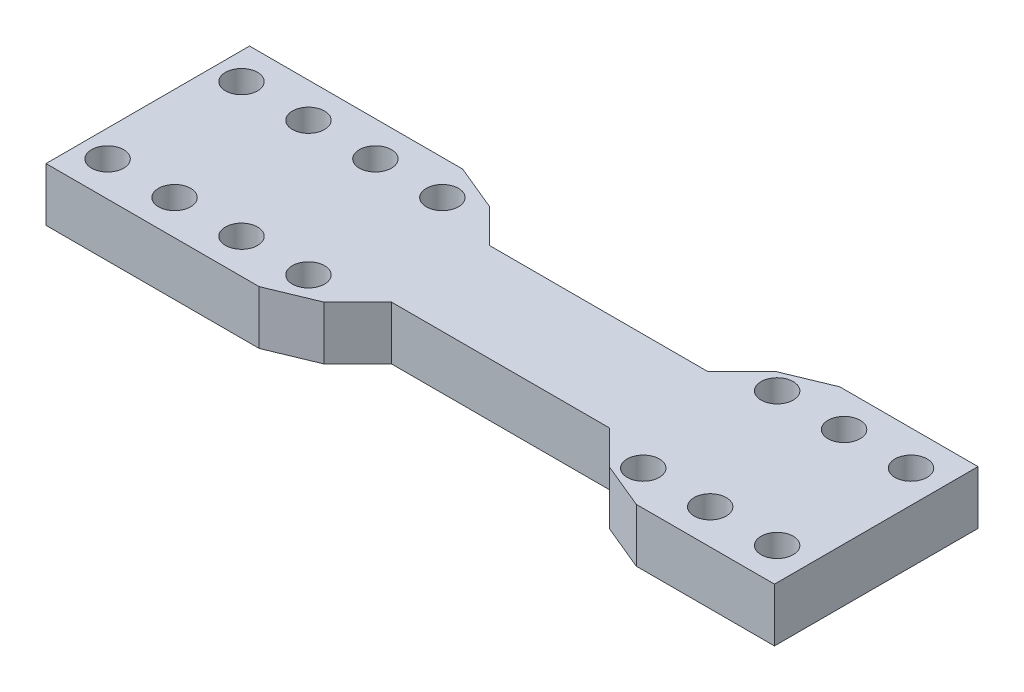
ISO-10303-21;
HEADER;
FILE_DESCRIPTION(('STEP AP214'),'2;1');
FILE_NAME('part.step','',(''),(''),'','','');
FILE_SCHEMA(('AUTOMOTIVE_DESIGN { 1 0 10303 214 1 1 1 1 }'));
ENDSEC;
DATA;
#1=APPLICATION_CONTEXT('core data for automotive mechanical design processes');
#2=APPLICATION_PROTOCOL_DEFINITION('international standard','automotive_design',2000,#1);
#3=PRODUCT_CONTEXT('',#1,'mechanical');
#4=PRODUCT('Part','Part','',(#3));
#5=PRODUCT_RELATED_PRODUCT_CATEGORY('part','',(#4));
#6=PRODUCT_DEFINITION_FORMATION('','',#4);
#7=PRODUCT_DEFINITION_CONTEXT('part definition',#1,'design');
#8=PRODUCT_DEFINITION('design','',#6,#7);
#9=PRODUCT_DEFINITION_SHAPE('','',#8);
#10=(LENGTH_UNIT() NAMED_UNIT(*) SI_UNIT(.MILLI.,.METRE.));
#11=(NAMED_UNIT(*) PLANE_ANGLE_UNIT() SI_UNIT($,.RADIAN.));
#12=(NAMED_UNIT(*) SI_UNIT($,.STERADIAN.) SOLID_ANGLE_UNIT());
#13=UNCERTAINTY_MEASURE_WITH_UNIT(LENGTH_MEASURE(1.E-05),#10,'distance_accuracy_value','');
#14=(GEOMETRIC_REPRESENTATION_CONTEXT(3) GLOBAL_UNCERTAINTY_ASSIGNED_CONTEXT((#13)) GLOBAL_UNIT_ASSIGNED_CONTEXT((#10,
#11,#12)) REPRESENTATION_CONTEXT('',''));
#15=CARTESIAN_POINT('',(0.,0.,0.));
#16=DIRECTION('',(0.,0.,1.));
#17=DIRECTION('',(1.,0.,0.));
#18=AXIS2_PLACEMENT_3D('',#15,#16,#17);
#19=CARTESIAN_POINT('',(0.,10.,0.));
#20=DIRECTION('',(0.,1.,0.));
#21=DIRECTION('',(0.,0.,1.));
#22=AXIS2_PLACEMENT_3D('',#19,#20,#21);
#23=PLANE('',#22);
#24=CARTESIAN_POINT('',(46.5304978161497,10.,3.85946325853004));
#25=DIRECTION('',(0.,1.,0.));
#26=DIRECTION('',(0.,0.,1.));
#27=AXIS2_PLACEMENT_3D('',#24,#25,#26);
#28=CIRCLE('',#27,3.);
#29=CARTESIAN_POINT('',(46.5304978161497,10.,6.85946325853004));
#30=VERTEX_POINT('',#29);
#31=EDGE_CURVE('E361',#30,#30,#28,.T.);
#32=ORIENTED_EDGE('',*,*,#31,.F.);
#33=EDGE_LOOP('',(#32));
#34=FACE_BOUND('',#33,.T.);
#35=CARTESIAN_POINT('',(59.0304978161497,10.,28.85946325853));
#36=DIRECTION('',(0.,1.,0.));
#37=DIRECTION('',(0.,0.,1.));
#38=AXIS2_PLACEMENT_3D('',#35,#36,#37);
#39=CIRCLE('',#38,3.);
#40=CARTESIAN_POINT('',(59.0304978161497,10.,31.85946325853));
#41=VERTEX_POINT('',#40);
#42=EDGE_CURVE('E349',#41,#41,#39,.T.);
#43=ORIENTED_EDGE('',*,*,#42,.F.);
#44=EDGE_LOOP('',(#43));
#45=FACE_BOUND('',#44,.T.);
#46=CARTESIAN_POINT('',(34.0304978161497,10.,3.85946325853004));
#47=DIRECTION('',(0.,1.,0.));
#48=DIRECTION('',(0.,0.,1.));
#49=AXIS2_PLACEMENT_3D('',#46,#47,#48);
#50=CIRCLE('',#49,3.00000000000001);
#51=CARTESIAN_POINT('',(34.0304978161497,10.,6.85946325853005));
#52=VERTEX_POINT('',#51);
#53=EDGE_CURVE('E337',#52,#52,#50,.T.);
#54=ORIENTED_EDGE('',*,*,#53,.F.);
#55=EDGE_LOOP('',(#54));
#56=FACE_BOUND('',#55,.T.);
#57=CARTESIAN_POINT('',(-28.4695021838503,10.,28.85946325853));
#58=DIRECTION('',(0.,1.,0.));
#59=DIRECTION('',(0.,0.,1.));
#60=AXIS2_PLACEMENT_3D('',#57,#58,#59);
#61=CIRCLE('',#60,3.);
#62=CARTESIAN_POINT('',(-28.4695021838503,10.,31.85946325853));
#63=VERTEX_POINT('',#62);
#64=EDGE_CURVE('E325',#63,#63,#61,.T.);
#65=ORIENTED_EDGE('',*,*,#64,.F.);
#66=EDGE_LOOP('',(#65));
#67=FACE_BOUND('',#66,.T.);
#68=CARTESIAN_POINT('',(-53.4695021838503,10.,3.85946325853004));
#69=DIRECTION('',(0.,1.,0.));
#70=DIRECTION('',(0.,0.,1.));
#71=AXIS2_PLACEMENT_3D('',#68,#69,#70);
#72=CIRCLE('',#71,3.00000000000001);
#73=CARTESIAN_POINT('',(-53.4695021838503,10.,6.85946325853005));
#74=VERTEX_POINT('',#73);
#75=EDGE_CURVE('E313',#74,#74,#72,.T.);
#76=ORIENTED_EDGE('',*,*,#75,.F.);
#77=EDGE_LOOP('',(#76));
#78=FACE_BOUND('',#77,.T.);
#79=CARTESIAN_POINT('',(-40.9695021838503,10.,28.85946325853));
#80=DIRECTION('',(0.,1.,0.));
#81=DIRECTION('',(0.,0.,1.));
#82=AXIS2_PLACEMENT_3D('',#79,#80,#81);
#83=CIRCLE('',#82,3.);
#84=CARTESIAN_POINT('',(-40.9695021838503,10.,31.85946325853));
#85=VERTEX_POINT('',#84);
#86=EDGE_CURVE('E301',#85,#85,#83,.T.);
#87=ORIENTED_EDGE('',*,*,#86,.F.);
#88=EDGE_LOOP('',(#87));
#89=FACE_BOUND('',#88,.T.);
#90=CARTESIAN_POINT('',(-65.9695021838503,10.,3.85946325853004));
#91=DIRECTION('',(0.,1.,0.));
#92=DIRECTION('',(0.,0.,1.));
#93=AXIS2_PLACEMENT_3D('',#90,#91,#92);
#94=CIRCLE('',#93,3.00000000000001);
#95=CARTESIAN_POINT('',(-65.9695021838503,10.,6.85946325853005));
#96=VERTEX_POINT('',#95);
#97=EDGE_CURVE('E201',#96,#96,#94,.T.);
#98=ORIENTED_EDGE('',*,*,#97,.F.);
#99=EDGE_LOOP('',(#98));
#100=FACE_BOUND('',#99,.T.);
#101=DIRECTION('',(0.707106781186522,0.,0.707106781186574));
#102=VECTOR('',#101,1.);
#103=CARTESIAN_POINT('',(24.3812054782563,10.,25.5081234563012));
#104=LINE('',#103,#102);
#105=CARTESIAN_POINT('',(24.3812054782563,10.,25.5081234563012));
#106=VERTEX_POINT('',#105);
#107=CARTESIAN_POINT('',(30.6970113745519,10.,31.8239293525971));
#108=VERTEX_POINT('',#107);
#109=EDGE_CURVE('E175',#106,#108,#104,.T.);
#110=ORIENTED_EDGE('',*,*,#109,.T.);
#111=DIRECTION('',(-0.92387953251128,0.,-0.382683432365105));
#112=VECTOR('',#111,1.);
#113=CARTESIAN_POINT('',(-6.75598488988871,10.,16.3103903483563));
#114=LINE('',#113,#112);
#115=CARTESIAN_POINT('',(39.2325452804846,10.,35.35946325853));
#116=VERTEX_POINT('',#115);
#117=EDGE_CURVE('E259',#108,#116,#114,.F.);
#118=ORIENTED_EDGE('',*,*,#117,.T.);
#119=DIRECTION('',(1.,0.,0.));
#120=VECTOR('',#119,1.);
#121=CARTESIAN_POINT('',(34.2325452804845,10.,35.35946325853));
#122=LINE('',#121,#120);
#123=CARTESIAN_POINT('',(65.0304978161497,10.,35.35946325853));
#124=VERTEX_POINT('',#123);
#125=EDGE_CURVE('E177',#116,#124,#122,.T.);
#126=ORIENTED_EDGE('',*,*,#125,.T.);
#127=DIRECTION('',(0.,0.,-1.));
#128=VECTOR('',#127,1.);
#129=CARTESIAN_POINT('',(65.0304978161497,10.,35.35946325853));
#130=LINE('',#129,#128);
#131=CARTESIAN_POINT('',(65.0304978161497,10.,-2.64053674146996));
#132=VERTEX_POINT('',#131);
#133=EDGE_CURVE('E182',#124,#132,#130,.T.);
#134=ORIENTED_EDGE('',*,*,#133,.T.);
#135=DIRECTION('',(-1.,0.,0.));
#136=VECTOR('',#135,1.);
#137=CARTESIAN_POINT('',(34.2325452804845,10.,-2.64053674146996));
#138=LINE('',#137,#136);
#139=CARTESIAN_POINT('',(39.2325452804845,10.,-2.64053674146996));
#140=VERTEX_POINT('',#139);
#141=EDGE_CURVE('E184',#132,#140,#138,.T.);
#142=ORIENTED_EDGE('',*,*,#141,.T.);
#143=DIRECTION('',(0.923879532511284,0.,-0.382683432365096));
#144=VECTOR('',#143,1.);
#145=CARTESIAN_POINT('',(4.81190251679016,10.,11.6169603168518));
#146=LINE('',#145,#144);
#147=CARTESIAN_POINT('',(30.6970113745518,10.,0.894997164462842));
#148=VERTEX_POINT('',#147);
#149=EDGE_CURVE('E256',#140,#148,#146,.F.);
#150=ORIENTED_EDGE('',*,*,#149,.T.);
#151=DIRECTION('',(-0.707106781186539,0.,0.707106781186556));
#152=VECTOR('',#151,1.);
#153=CARTESIAN_POINT('',(24.3812054782563,10.,7.21080306075843));
#154=LINE('',#153,#152);
#155=CARTESIAN_POINT('',(24.3812054782563,10.,7.21080306075843));
#156=VERTEX_POINT('',#155);
#157=EDGE_CURVE('E187',#148,#156,#154,.T.);
#158=ORIENTED_EDGE('',*,*,#157,.T.);
#159=DIRECTION('',(-1.,0.,0.));
#160=VECTOR('',#159,1.);
#161=CARTESIAN_POINT('',(-16.3292290877633,10.,7.21080306075843));
#162=LINE('',#161,#160);
#163=CARTESIAN_POINT('',(-16.3292290877633,10.,7.21080306075843));
#164=VERTEX_POINT('',#163);
#165=EDGE_CURVE('E189',#156,#164,#162,.T.);
#166=ORIENTED_EDGE('',*,*,#165,.T.);
#167=DIRECTION('',(-0.707106781186556,0.,-0.707106781186539));
#168=VECTOR('',#167,1.);
#169=CARTESIAN_POINT('',(-26.180568889992,10.,-2.64053674146996));
#170=LINE('',#169,#168);
#171=CARTESIAN_POINT('',(-22.6450349840591,10.,0.894997164462787));
#172=VERTEX_POINT('',#171);
#173=EDGE_CURVE('E191',#164,#172,#170,.T.);
#174=ORIENTED_EDGE('',*,*,#173,.T.);
#175=DIRECTION('',(0.923879532511289,0.,0.382683432365084));
#176=VECTOR('',#175,1.);
#177=CARTESIAN_POINT('',(-3.63271787537924,10.,8.77015676301589));
#178=LINE('',#177,#176);
#179=CARTESIAN_POINT('',(-31.180568889992,10.,-2.64053674146996));
#180=VERTEX_POINT('',#179);
#181=EDGE_CURVE('E51',#172,#180,#178,.F.);
#182=ORIENTED_EDGE('',*,*,#181,.T.);
#183=DIRECTION('',(-1.,0.,0.));
#184=VECTOR('',#183,1.);
#185=CARTESIAN_POINT('',(-70.9695021838503,10.,-2.64053674146996));
#186=LINE('',#185,#184);
#187=CARTESIAN_POINT('',(-70.9695021838503,10.,-2.64053674146996));
#188=VERTEX_POINT('',#187);
#189=EDGE_CURVE('E193',#180,#188,#186,.T.);
#190=ORIENTED_EDGE('',*,*,#189,.T.);
#191=DIRECTION('',(0.,0.,1.));
#192=VECTOR('',#191,1.);
#193=CARTESIAN_POINT('',(-70.9695021838503,10.,35.35946325853));
#194=LINE('',#193,#192);
#195=CARTESIAN_POINT('',(-70.9695021838503,10.,35.35946325853));
#196=VERTEX_POINT('',#195);
#197=EDGE_CURVE('E195',#188,#196,#194,.T.);
#198=ORIENTED_EDGE('',*,*,#197,.T.);
#199=DIRECTION('',(1.,0.,0.));
#200=VECTOR('',#199,1.);
#201=CARTESIAN_POINT('',(-70.9695021838503,10.,35.35946325853));
#202=LINE('',#201,#200);
#203=CARTESIAN_POINT('',(-31.180568889992,10.,35.35946325853));
#204=VERTEX_POINT('',#203);
#205=EDGE_CURVE('E160',#196,#204,#202,.T.);
#206=ORIENTED_EDGE('',*,*,#205,.T.);
#207=DIRECTION('',(-0.923879532511285,0.,0.382683432365095));
#208=VECTOR('',#207,1.);
#209=CARTESIAN_POINT('',(7.93516953129942,10.,19.1571939021925));
#210=LINE('',#209,#208);
#211=CARTESIAN_POINT('',(-22.6450349840592,10.,31.8239293525972));
#212=VERTEX_POINT('',#211);
#213=EDGE_CURVE('E156',#204,#212,#210,.F.);
#214=ORIENTED_EDGE('',*,*,#213,.T.);
#215=DIRECTION('',(0.707106781186539,0.,-0.707106781186556));
#216=VECTOR('',#215,1.);
#217=CARTESIAN_POINT('',(-26.180568889992,10.,35.35946325853));
#218=LINE('',#217,#216);
#219=CARTESIAN_POINT('',(-16.3292290877633,10.,25.5081234563012));
#220=VERTEX_POINT('',#219);
#221=EDGE_CURVE('E147',#212,#220,#218,.T.);
#222=ORIENTED_EDGE('',*,*,#221,.T.);
#223=DIRECTION('',(1.,0.,0.));
#224=VECTOR('',#223,1.);
#225=CARTESIAN_POINT('',(-16.3292290877633,10.,25.5081234563012));
#226=LINE('',#225,#224);
#227=EDGE_CURVE('E152',#220,#106,#226,.T.);
#228=ORIENTED_EDGE('',*,*,#227,.T.);
#229=EDGE_LOOP('',(#110,#118,#126,#134,#142,#150,#158,#166,#174,#182,#190,#198,#206,#214,#222,#228));
#230=FACE_BOUND('',#229,.T.);
#231=CARTESIAN_POINT('',(-40.9695021838503,10.,3.85946325853004));
#232=DIRECTION('',(0.,1.,0.));
#233=DIRECTION('',(0.,0.,1.));
#234=AXIS2_PLACEMENT_3D('',#231,#232,#233);
#235=CIRCLE('',#234,3.);
#236=CARTESIAN_POINT('',(-40.9695021838503,10.,6.85946325853004));
#237=VERTEX_POINT('',#236);
#238=EDGE_CURVE('E295',#237,#237,#235,.T.);
#239=ORIENTED_EDGE('',*,*,#238,.F.);
#240=EDGE_LOOP('',(#239));
#241=FACE_BOUND('',#240,.T.);
#242=CARTESIAN_POINT('',(-65.9695021838503,10.,28.85946325853));
#243=DIRECTION('',(0.,1.,0.));
#244=DIRECTION('',(0.,0.,1.));
#245=AXIS2_PLACEMENT_3D('',#242,#243,#244);
#246=CIRCLE('',#245,3.00000000000001);
#247=CARTESIAN_POINT('',(-65.9695021838503,10.,31.85946325853));
#248=VERTEX_POINT('',#247);
#249=EDGE_CURVE('E307',#248,#248,#246,.T.);
#250=ORIENTED_EDGE('',*,*,#249,.F.);
#251=EDGE_LOOP('',(#250));
#252=FACE_BOUND('',#251,.T.);
#253=CARTESIAN_POINT('',(-28.4695021838503,10.,3.85946325853004));
#254=DIRECTION('',(0.,1.,0.));
#255=DIRECTION('',(0.,0.,1.));
#256=AXIS2_PLACEMENT_3D('',#253,#254,#255);
#257=CIRCLE('',#256,3.);
#258=CARTESIAN_POINT('',(-28.4695021838503,10.,6.85946325853004));
#259=VERTEX_POINT('',#258);
#260=EDGE_CURVE('E319',#259,#259,#257,.T.);
#261=ORIENTED_EDGE('',*,*,#260,.F.);
#262=EDGE_LOOP('',(#261));
#263=FACE_BOUND('',#262,.T.);
#264=CARTESIAN_POINT('',(-53.4695021838503,10.,28.85946325853));
#265=DIRECTION('',(0.,1.,0.));
#266=DIRECTION('',(0.,0.,1.));
#267=AXIS2_PLACEMENT_3D('',#264,#265,#266);
#268=CIRCLE('',#267,3.00000000000001);
#269=CARTESIAN_POINT('',(-53.4695021838503,10.,31.85946325853));
#270=VERTEX_POINT('',#269);
#271=EDGE_CURVE('E331',#270,#270,#268,.T.);
#272=ORIENTED_EDGE('',*,*,#271,.F.);
#273=EDGE_LOOP('',(#272));
#274=FACE_BOUND('',#273,.T.);
#275=CARTESIAN_POINT('',(59.0304978161497,10.,3.85946325853004));
#276=DIRECTION('',(0.,1.,0.));
#277=DIRECTION('',(0.,0.,1.));
#278=AXIS2_PLACEMENT_3D('',#275,#276,#277);
#279=CIRCLE('',#278,3.);
#280=CARTESIAN_POINT('',(59.0304978161497,10.,6.85946325853004));
#281=VERTEX_POINT('',#280);
#282=EDGE_CURVE('E343',#281,#281,#279,.T.);
#283=ORIENTED_EDGE('',*,*,#282,.F.);
#284=EDGE_LOOP('',(#283));
#285=FACE_BOUND('',#284,.T.);
#286=CARTESIAN_POINT('',(34.0304978161497,10.,28.85946325853));
#287=DIRECTION('',(0.,1.,0.));
#288=DIRECTION('',(0.,0.,1.));
#289=AXIS2_PLACEMENT_3D('',#286,#287,#288);
#290=CIRCLE('',#289,3.00000000000001);
#291=CARTESIAN_POINT('',(34.0304978161497,10.,31.85946325853));
#292=VERTEX_POINT('',#291);
#293=EDGE_CURVE('E355',#292,#292,#290,.T.);
#294=ORIENTED_EDGE('',*,*,#293,.F.);
#295=EDGE_LOOP('',(#294));
#296=FACE_BOUND('',#295,.T.);
#297=CARTESIAN_POINT('',(46.5304978161497,10.,28.85946325853));
#298=DIRECTION('',(0.,1.,0.));
#299=DIRECTION('',(0.,0.,1.));
#300=AXIS2_PLACEMENT_3D('',#297,#298,#299);
#301=CIRCLE('',#300,3.);
#302=CARTESIAN_POINT('',(46.5304978161497,10.,31.85946325853));
#303=VERTEX_POINT('',#302);
#304=EDGE_CURVE('E367',#303,#303,#301,.T.);
#305=ORIENTED_EDGE('',*,*,#304,.F.);
#306=EDGE_LOOP('',(#305));
#307=FACE_BOUND('',#306,.T.);
#308=ADVANCED_FACE('F35',(#34,#45,#56,#67,#78,#89,#100,#230,#241,#252,#263,#274,#285,#296,#307),
#23,.T.);
#309=CARTESIAN_POINT('',(0.,0.,0.));
#310=DIRECTION('',(0.,1.,0.));
#311=DIRECTION('',(0.,0.,1.));
#312=AXIS2_PLACEMENT_3D('',#309,#310,#311);
#313=PLANE('',#312);
#314=DIRECTION('',(1.,0.,0.));
#315=VECTOR('',#314,1.);
#316=CARTESIAN_POINT('',(34.2325452804845,0.,35.35946325853));
#317=LINE('',#316,#315);
#318=CARTESIAN_POINT('',(39.2325452804846,0.,35.35946325853));
#319=VERTEX_POINT('',#318);
#320=CARTESIAN_POINT('',(65.0304978161497,0.,35.35946325853));
#321=VERTEX_POINT('',#320);
#322=EDGE_CURVE('E208',#319,#321,#317,.T.);
#323=ORIENTED_EDGE('',*,*,#322,.F.);
#324=DIRECTION('',(0.92387953251128,0.,0.382683432365105));
#325=VECTOR('',#324,1.);
#326=CARTESIAN_POINT('',(39.2325452804846,0.,35.35946325853));
#327=LINE('',#326,#325);
#328=CARTESIAN_POINT('',(30.6970113745519,0.,31.8239293525971));
#329=VERTEX_POINT('',#328);
#330=EDGE_CURVE('E251',#319,#329,#327,.F.);
#331=ORIENTED_EDGE('',*,*,#330,.T.);
#332=DIRECTION('',(0.707106781186522,0.,0.707106781186574));
#333=VECTOR('',#332,1.);
#334=CARTESIAN_POINT('',(24.3812054782563,0.,25.5081234563012));
#335=LINE('',#334,#333);
#336=CARTESIAN_POINT('',(24.3812054782563,0.,25.5081234563012));
#337=VERTEX_POINT('',#336);
#338=EDGE_CURVE('E205',#337,#329,#335,.T.);
#339=ORIENTED_EDGE('',*,*,#338,.F.);
#340=DIRECTION('',(1.,0.,0.));
#341=VECTOR('',#340,1.);
#342=CARTESIAN_POINT('',(-16.3292290877633,0.,25.5081234563012));
#343=LINE('',#342,#341);
#344=CARTESIAN_POINT('',(-16.3292290877633,0.,25.5081234563012));
#345=VERTEX_POINT('',#344);
#346=EDGE_CURVE('E203',#345,#337,#343,.T.);
#347=ORIENTED_EDGE('',*,*,#346,.F.);
#348=DIRECTION('',(0.707106781186539,0.,-0.707106781186556));
#349=VECTOR('',#348,1.);
#350=CARTESIAN_POINT('',(-26.180568889992,0.,35.35946325853));
#351=LINE('',#350,#349);
#352=CARTESIAN_POINT('',(-22.6450349840592,0.,31.8239293525972));
#353=VERTEX_POINT('',#352);
#354=EDGE_CURVE('E166',#353,#345,#351,.T.);
#355=ORIENTED_EDGE('',*,*,#354,.F.);
#356=DIRECTION('',(0.923879532511285,0.,-0.382683432365095));
#357=VECTOR('',#356,1.);
#358=CARTESIAN_POINT('',(-22.6450349840592,0.,31.8239293525972));
#359=LINE('',#358,#357);
#360=CARTESIAN_POINT('',(-31.180568889992,0.,35.35946325853));
#361=VERTEX_POINT('',#360);
#362=EDGE_CURVE('E249',#353,#361,#359,.F.);
#363=ORIENTED_EDGE('',*,*,#362,.T.);
#364=DIRECTION('',(1.,0.,0.));
#365=VECTOR('',#364,1.);
#366=CARTESIAN_POINT('',(-70.9695021838503,0.,35.35946325853));
#367=LINE('',#366,#365);
#368=CARTESIAN_POINT('',(-70.9695021838503,0.,35.35946325853));
#369=VERTEX_POINT('',#368);
#370=EDGE_CURVE('E198',#369,#361,#367,.T.);
#371=ORIENTED_EDGE('',*,*,#370,.F.);
#372=DIRECTION('',(0.,0.,1.));
#373=VECTOR('',#372,1.);
#374=CARTESIAN_POINT('',(-70.9695021838503,0.,35.35946325853));
#375=LINE('',#374,#373);
#376=CARTESIAN_POINT('',(-70.9695021838503,0.,-2.64053674146996));
#377=VERTEX_POINT('',#376);
#378=EDGE_CURVE('E223',#377,#369,#375,.T.);
#379=ORIENTED_EDGE('',*,*,#378,.F.);
#380=DIRECTION('',(-1.,0.,0.));
#381=VECTOR('',#380,1.);
#382=CARTESIAN_POINT('',(-70.9695021838503,0.,-2.64053674146996));
#383=LINE('',#382,#381);
#384=CARTESIAN_POINT('',(-31.180568889992,0.,-2.64053674146996));
#385=VERTEX_POINT('',#384);
#386=EDGE_CURVE('E221',#385,#377,#383,.T.);
#387=ORIENTED_EDGE('',*,*,#386,.F.);
#388=DIRECTION('',(-0.923879532511289,0.,-0.382683432365084));
#389=VECTOR('',#388,1.);
#390=CARTESIAN_POINT('',(-31.180568889992,0.,-2.64053674146996));
#391=LINE('',#390,#389);
#392=CARTESIAN_POINT('',(-22.6450349840591,0.,0.894997164462787));
#393=VERTEX_POINT('',#392);
#394=EDGE_CURVE('E245',#385,#393,#391,.F.);
#395=ORIENTED_EDGE('',*,*,#394,.T.);
#396=DIRECTION('',(-0.707106781186556,0.,-0.707106781186539));
#397=VECTOR('',#396,1.);
#398=CARTESIAN_POINT('',(-26.180568889992,0.,-2.64053674146996));
#399=LINE('',#398,#397);
#400=CARTESIAN_POINT('',(-16.3292290877633,0.,7.21080306075843));
#401=VERTEX_POINT('',#400);
#402=EDGE_CURVE('E219',#401,#393,#399,.T.);
#403=ORIENTED_EDGE('',*,*,#402,.F.);
#404=DIRECTION('',(-1.,0.,0.));
#405=VECTOR('',#404,1.);
#406=CARTESIAN_POINT('',(-16.3292290877633,0.,7.21080306075843));
#407=LINE('',#406,#405);
#408=CARTESIAN_POINT('',(24.3812054782563,0.,7.21080306075843));
#409=VERTEX_POINT('',#408);
#410=EDGE_CURVE('E217',#409,#401,#407,.T.);
#411=ORIENTED_EDGE('',*,*,#410,.F.);
#412=DIRECTION('',(-0.707106781186539,0.,0.707106781186556));
#413=VECTOR('',#412,1.);
#414=CARTESIAN_POINT('',(24.3812054782563,0.,7.21080306075843));
#415=LINE('',#414,#413);
#416=CARTESIAN_POINT('',(30.6970113745518,0.,0.894997164462842));
#417=VERTEX_POINT('',#416);
#418=EDGE_CURVE('E215',#417,#409,#415,.T.);
#419=ORIENTED_EDGE('',*,*,#418,.F.);
#420=DIRECTION('',(-0.923879532511284,0.,0.382683432365096));
#421=VECTOR('',#420,1.);
#422=CARTESIAN_POINT('',(30.6970113745518,0.,0.894997164462841));
#423=LINE('',#422,#421);
#424=CARTESIAN_POINT('',(39.2325452804845,0.,-2.64053674146996));
#425=VERTEX_POINT('',#424);
#426=EDGE_CURVE('E247',#417,#425,#423,.F.);
#427=ORIENTED_EDGE('',*,*,#426,.T.);
#428=DIRECTION('',(-1.,0.,0.));
#429=VECTOR('',#428,1.);
#430=CARTESIAN_POINT('',(34.2325452804845,0.,-2.64053674146996));
#431=LINE('',#430,#429);
#432=CARTESIAN_POINT('',(65.0304978161497,0.,-2.64053674146996));
#433=VERTEX_POINT('',#432);
#434=EDGE_CURVE('E212',#433,#425,#431,.T.);
#435=ORIENTED_EDGE('',*,*,#434,.F.);
#436=DIRECTION('',(0.,0.,-1.));
#437=VECTOR('',#436,1.);
#438=CARTESIAN_POINT('',(65.0304978161497,0.,35.35946325853));
#439=LINE('',#438,#437);
#440=EDGE_CURVE('E210',#321,#433,#439,.T.);
#441=ORIENTED_EDGE('',*,*,#440,.F.);
#442=EDGE_LOOP('',(#323,#331,#339,#347,#355,#363,#371,#379,#387,#395,#403,#411,#419,#427,#435,#441));
#443=FACE_BOUND('',#442,.T.);
#444=CARTESIAN_POINT('',(-65.9695021838503,0.,3.85946325853004));
#445=DIRECTION('',(0.,1.,0.));
#446=DIRECTION('',(0.,0.,1.));
#447=AXIS2_PLACEMENT_3D('',#444,#445,#446);
#448=CIRCLE('',#447,3.00000000000001);
#449=CARTESIAN_POINT('',(-65.9695021838503,0.,6.85946325853005));
#450=VERTEX_POINT('',#449);
#451=EDGE_CURVE('E292',#450,#450,#448,.T.);
#452=ORIENTED_EDGE('',*,*,#451,.T.);
#453=EDGE_LOOP('',(#452));
#454=FACE_BOUND('',#453,.T.);
#455=CARTESIAN_POINT('',(-40.9695021838503,0.,3.85946325853004));
#456=DIRECTION('',(0.,1.,0.));
#457=DIRECTION('',(0.,0.,1.));
#458=AXIS2_PLACEMENT_3D('',#455,#456,#457);
#459=CIRCLE('',#458,3.);
#460=CARTESIAN_POINT('',(-40.9695021838503,0.,6.85946325853004));
#461=VERTEX_POINT('',#460);
#462=EDGE_CURVE('E298',#461,#461,#459,.T.);
#463=ORIENTED_EDGE('',*,*,#462,.T.);
#464=EDGE_LOOP('',(#463));
#465=FACE_BOUND('',#464,.T.);
#466=CARTESIAN_POINT('',(-40.9695021838503,0.,28.85946325853));
#467=DIRECTION('',(0.,1.,0.));
#468=DIRECTION('',(0.,0.,1.));
#469=AXIS2_PLACEMENT_3D('',#466,#467,#468);
#470=CIRCLE('',#469,3.);
#471=CARTESIAN_POINT('',(-40.9695021838503,0.,31.85946325853));
#472=VERTEX_POINT('',#471);
#473=EDGE_CURVE('E304',#472,#472,#470,.T.);
#474=ORIENTED_EDGE('',*,*,#473,.T.);
#475=EDGE_LOOP('',(#474));
#476=FACE_BOUND('',#475,.T.);
#477=CARTESIAN_POINT('',(-65.9695021838503,0.,28.85946325853));
#478=DIRECTION('',(0.,1.,0.));
#479=DIRECTION('',(0.,0.,1.));
#480=AXIS2_PLACEMENT_3D('',#477,#478,#479);
#481=CIRCLE('',#480,3.00000000000001);
#482=CARTESIAN_POINT('',(-65.9695021838503,0.,31.85946325853));
#483=VERTEX_POINT('',#482);
#484=EDGE_CURVE('E310',#483,#483,#481,.T.);
#485=ORIENTED_EDGE('',*,*,#484,.T.);
#486=EDGE_LOOP('',(#485));
#487=FACE_BOUND('',#486,.T.);
#488=CARTESIAN_POINT('',(-53.4695021838503,0.,3.85946325853004));
#489=DIRECTION('',(0.,1.,0.));
#490=DIRECTION('',(0.,0.,1.));
#491=AXIS2_PLACEMENT_3D('',#488,#489,#490);
#492=CIRCLE('',#491,3.00000000000001);
#493=CARTESIAN_POINT('',(-53.4695021838503,0.,6.85946325853005));
#494=VERTEX_POINT('',#493);
#495=EDGE_CURVE('E316',#494,#494,#492,.T.);
#496=ORIENTED_EDGE('',*,*,#495,.T.);
#497=EDGE_LOOP('',(#496));
#498=FACE_BOUND('',#497,.T.);
#499=CARTESIAN_POINT('',(-28.4695021838503,0.,3.85946325853004));
#500=DIRECTION('',(0.,1.,0.));
#501=DIRECTION('',(0.,0.,1.));
#502=AXIS2_PLACEMENT_3D('',#499,#500,#501);
#503=CIRCLE('',#502,3.);
#504=CARTESIAN_POINT('',(-28.4695021838503,0.,6.85946325853004));
#505=VERTEX_POINT('',#504);
#506=EDGE_CURVE('E322',#505,#505,#503,.T.);
#507=ORIENTED_EDGE('',*,*,#506,.T.);
#508=EDGE_LOOP('',(#507));
#509=FACE_BOUND('',#508,.T.);
#510=CARTESIAN_POINT('',(-28.4695021838503,0.,28.85946325853));
#511=DIRECTION('',(0.,1.,0.));
#512=DIRECTION('',(0.,0.,1.));
#513=AXIS2_PLACEMENT_3D('',#510,#511,#512);
#514=CIRCLE('',#513,3.);
#515=CARTESIAN_POINT('',(-28.4695021838503,0.,31.85946325853));
#516=VERTEX_POINT('',#515);
#517=EDGE_CURVE('E328',#516,#516,#514,.T.);
#518=ORIENTED_EDGE('',*,*,#517,.T.);
#519=EDGE_LOOP('',(#518));
#520=FACE_BOUND('',#519,.T.);
#521=CARTESIAN_POINT('',(-53.4695021838503,0.,28.85946325853));
#522=DIRECTION('',(0.,1.,0.));
#523=DIRECTION('',(0.,0.,1.));
#524=AXIS2_PLACEMENT_3D('',#521,#522,#523);
#525=CIRCLE('',#524,3.00000000000001);
#526=CARTESIAN_POINT('',(-53.4695021838503,0.,31.85946325853));
#527=VERTEX_POINT('',#526);
#528=EDGE_CURVE('E334',#527,#527,#525,.T.);
#529=ORIENTED_EDGE('',*,*,#528,.T.);
#530=EDGE_LOOP('',(#529));
#531=FACE_BOUND('',#530,.T.);
#532=CARTESIAN_POINT('',(34.0304978161497,0.,3.85946325853004));
#533=DIRECTION('',(0.,1.,0.));
#534=DIRECTION('',(0.,0.,1.));
#535=AXIS2_PLACEMENT_3D('',#532,#533,#534);
#536=CIRCLE('',#535,3.00000000000001);
#537=CARTESIAN_POINT('',(34.0304978161497,0.,6.85946325853005));
#538=VERTEX_POINT('',#537);
#539=EDGE_CURVE('E340',#538,#538,#536,.T.);
#540=ORIENTED_EDGE('',*,*,#539,.T.);
#541=EDGE_LOOP('',(#540));
#542=FACE_BOUND('',#541,.T.);
#543=CARTESIAN_POINT('',(59.0304978161497,0.,3.85946325853004));
#544=DIRECTION('',(0.,1.,0.));
#545=DIRECTION('',(0.,0.,1.));
#546=AXIS2_PLACEMENT_3D('',#543,#544,#545);
#547=CIRCLE('',#546,3.);
#548=CARTESIAN_POINT('',(59.0304978161497,0.,6.85946325853004));
#549=VERTEX_POINT('',#548);
#550=EDGE_CURVE('E346',#549,#549,#547,.T.);
#551=ORIENTED_EDGE('',*,*,#550,.T.);
#552=EDGE_LOOP('',(#551));
#553=FACE_BOUND('',#552,.T.);
#554=CARTESIAN_POINT('',(59.0304978161497,0.,28.85946325853));
#555=DIRECTION('',(0.,1.,0.));
#556=DIRECTION('',(0.,0.,1.));
#557=AXIS2_PLACEMENT_3D('',#554,#555,#556);
#558=CIRCLE('',#557,3.);
#559=CARTESIAN_POINT('',(59.0304978161497,0.,31.85946325853));
#560=VERTEX_POINT('',#559);
#561=EDGE_CURVE('E352',#560,#560,#558,.T.);
#562=ORIENTED_EDGE('',*,*,#561,.T.);
#563=EDGE_LOOP('',(#562));
#564=FACE_BOUND('',#563,.T.);
#565=CARTESIAN_POINT('',(34.0304978161497,0.,28.85946325853));
#566=DIRECTION('',(0.,1.,0.));
#567=DIRECTION('',(0.,0.,1.));
#568=AXIS2_PLACEMENT_3D('',#565,#566,#567);
#569=CIRCLE('',#568,3.00000000000001);
#570=CARTESIAN_POINT('',(34.0304978161497,0.,31.85946325853));
#571=VERTEX_POINT('',#570);
#572=EDGE_CURVE('E358',#571,#571,#569,.T.);
#573=ORIENTED_EDGE('',*,*,#572,.T.);
#574=EDGE_LOOP('',(#573));
#575=FACE_BOUND('',#574,.T.);
#576=CARTESIAN_POINT('',(46.5304978161497,0.,3.85946325853004));
#577=DIRECTION('',(0.,1.,0.));
#578=DIRECTION('',(0.,0.,1.));
#579=AXIS2_PLACEMENT_3D('',#576,#577,#578);
#580=CIRCLE('',#579,3.);
#581=CARTESIAN_POINT('',(46.5304978161497,0.,6.85946325853004));
#582=VERTEX_POINT('',#581);
#583=EDGE_CURVE('E364',#582,#582,#580,.T.);
#584=ORIENTED_EDGE('',*,*,#583,.T.);
#585=EDGE_LOOP('',(#584));
#586=FACE_BOUND('',#585,.T.);
#587=CARTESIAN_POINT('',(46.5304978161497,0.,28.85946325853));
#588=DIRECTION('',(0.,1.,0.));
#589=DIRECTION('',(0.,0.,1.));
#590=AXIS2_PLACEMENT_3D('',#587,#588,#589);
#591=CIRCLE('',#590,3.);
#592=CARTESIAN_POINT('',(46.5304978161497,0.,31.85946325853));
#593=VERTEX_POINT('',#592);
#594=EDGE_CURVE('E370',#593,#593,#591,.T.);
#595=ORIENTED_EDGE('',*,*,#594,.T.);
#596=EDGE_LOOP('',(#595));
#597=FACE_BOUND('',#596,.T.);
#598=ADVANCED_FACE('F279',(#443,#454,#465,#476,#487,#498,#509,#520,#531,#542,#553,#564,#575,
#586,#597),#313,.F.);
#599=CARTESIAN_POINT('',(-70.9695021838503,10.,35.35946325853));
#600=DIRECTION('',(0.,0.,-1.));
#601=DIRECTION('',(-1.,0.,0.));
#602=AXIS2_PLACEMENT_3D('',#599,#600,#601);
#603=PLANE('',#602);
#604=ORIENTED_EDGE('',*,*,#370,.T.);
#605=DIRECTION('',(0.,1.,0.));
#606=VECTOR('',#605,1.);
#607=CARTESIAN_POINT('',(-31.180568889992,10.,35.35946325853));
#608=LINE('',#607,#606);
#609=EDGE_CURVE('E263',#361,#204,#608,.T.);
#610=ORIENTED_EDGE('',*,*,#609,.T.);
#611=ORIENTED_EDGE('',*,*,#205,.F.);
#612=DIRECTION('',(0.,-1.,0.));
#613=VECTOR('',#612,1.);
#614=CARTESIAN_POINT('',(-70.9695021838503,10.,35.35946325853));
#615=LINE('',#614,#613);
#616=EDGE_CURVE('E197',#196,#369,#615,.T.);
#617=ORIENTED_EDGE('',*,*,#616,.T.);
#618=EDGE_LOOP('',(#604,#610,#611,#617));
#619=FACE_BOUND('',#618,.T.);
#620=ADVANCED_FACE('F289',(#619),#603,.F.);
#621=CARTESIAN_POINT('',(-26.180568889992,10.,35.35946325853));
#622=DIRECTION('',(-0.707106781186556,0.,-0.707106781186539));
#623=DIRECTION('',(-0.707106781186539,0.,0.707106781186556));
#624=AXIS2_PLACEMENT_3D('',#621,#622,#623);
#625=PLANE('',#624);
#626=ORIENTED_EDGE('',*,*,#221,.F.);
#627=DIRECTION('',(0.,-1.,0.));
#628=VECTOR('',#627,1.);
#629=CARTESIAN_POINT('',(-22.6450349840592,10.,31.8239293525972));
#630=LINE('',#629,#628);
#631=EDGE_CURVE('E261',#212,#353,#630,.T.);
#632=ORIENTED_EDGE('',*,*,#631,.T.);
#633=ORIENTED_EDGE('',*,*,#354,.T.);
#634=DIRECTION('',(0.,-1.,0.));
#635=VECTOR('',#634,1.);
#636=CARTESIAN_POINT('',(-16.3292290877633,10.,25.5081234563012));
#637=LINE('',#636,#635);
#638=EDGE_CURVE('E163',#220,#345,#637,.T.);
#639=ORIENTED_EDGE('',*,*,#638,.F.);
#640=EDGE_LOOP('',(#626,#632,#633,#639));
#641=FACE_BOUND('',#640,.T.);
#642=ADVANCED_FACE('F164',(#641),#625,.F.);
#643=CARTESIAN_POINT('',(-16.3292290877633,10.,25.5081234563012));
#644=DIRECTION('',(0.,0.,-1.));
#645=DIRECTION('',(-1.,0.,0.));
#646=AXIS2_PLACEMENT_3D('',#643,#644,#645);
#647=PLANE('',#646);
#648=ORIENTED_EDGE('',*,*,#346,.T.);
#649=DIRECTION('',(0.,-1.,0.));
#650=VECTOR('',#649,1.);
#651=CARTESIAN_POINT('',(24.3812054782563,10.,25.5081234563012));
#652=LINE('',#651,#650);
#653=EDGE_CURVE('E170',#106,#337,#652,.T.);
#654=ORIENTED_EDGE('',*,*,#653,.F.);
#655=ORIENTED_EDGE('',*,*,#227,.F.);
#656=ORIENTED_EDGE('',*,*,#638,.T.);
#657=EDGE_LOOP('',(#648,#654,#655,#656));
#658=FACE_BOUND('',#657,.T.);
#659=ADVANCED_FACE('F172',(#658),#647,.F.);
#660=CARTESIAN_POINT('',(24.3812054782563,10.,25.5081234563012));
#661=DIRECTION('',(0.707106781186574,0.,-0.707106781186522));
#662=DIRECTION('',(-0.707106781186522,0.,-0.707106781186574));
#663=AXIS2_PLACEMENT_3D('',#660,#661,#662);
#664=PLANE('',#663);
#665=ORIENTED_EDGE('',*,*,#338,.T.);
#666=DIRECTION('',(0.,1.,0.));
#667=VECTOR('',#666,1.);
#668=CARTESIAN_POINT('',(30.6970113745519,10.,31.8239293525971));
#669=LINE('',#668,#667);
#670=EDGE_CURVE('E253',#329,#108,#669,.T.);
#671=ORIENTED_EDGE('',*,*,#670,.T.);
#672=ORIENTED_EDGE('',*,*,#109,.F.);
#673=ORIENTED_EDGE('',*,*,#653,.T.);
#674=EDGE_LOOP('',(#665,#671,#672,#673));
#675=FACE_BOUND('',#674,.T.);
#676=ADVANCED_FACE('F418',(#675),#664,.F.);
#677=CARTESIAN_POINT('',(34.2325452804845,10.,35.35946325853));
#678=DIRECTION('',(0.,0.,-1.));
#679=DIRECTION('',(-1.,0.,0.));
#680=AXIS2_PLACEMENT_3D('',#677,#678,#679);
#681=PLANE('',#680);
#682=ORIENTED_EDGE('',*,*,#125,.F.);
#683=DIRECTION('',(0.,-1.,0.));
#684=VECTOR('',#683,1.);
#685=CARTESIAN_POINT('',(39.2325452804846,10.,35.35946325853));
#686=LINE('',#685,#684);
#687=EDGE_CURVE('E169',#116,#319,#686,.T.);
#688=ORIENTED_EDGE('',*,*,#687,.T.);
#689=ORIENTED_EDGE('',*,*,#322,.T.);
#690=DIRECTION('',(0.,-1.,0.));
#691=VECTOR('',#690,1.);
#692=CARTESIAN_POINT('',(65.0304978161497,10.,35.35946325853));
#693=LINE('',#692,#691);
#694=EDGE_CURVE('E239',#124,#321,#693,.T.);
#695=ORIENTED_EDGE('',*,*,#694,.F.);
#696=EDGE_LOOP('',(#682,#688,#689,#695));
#697=FACE_BOUND('',#696,.T.);
#698=ADVANCED_FACE('F414',(#697),#681,.F.);
#699=CARTESIAN_POINT('',(65.0304978161497,10.,35.35946325853));
#700=DIRECTION('',(-1.,0.,0.));
#701=DIRECTION('',(0.,0.,1.));
#702=AXIS2_PLACEMENT_3D('',#699,#700,#701);
#703=PLANE('',#702);
#704=ORIENTED_EDGE('',*,*,#440,.T.);
#705=DIRECTION('',(0.,-1.,0.));
#706=VECTOR('',#705,1.);
#707=CARTESIAN_POINT('',(65.0304978161497,10.,-2.64053674146996));
#708=LINE('',#707,#706);
#709=EDGE_CURVE('E236',#132,#433,#708,.T.);
#710=ORIENTED_EDGE('',*,*,#709,.F.);
#711=ORIENTED_EDGE('',*,*,#133,.F.);
#712=ORIENTED_EDGE('',*,*,#694,.T.);
#713=EDGE_LOOP('',(#704,#710,#711,#712));
#714=FACE_BOUND('',#713,.T.);
#715=ADVANCED_FACE('F410',(#714),#703,.F.);
#716=CARTESIAN_POINT('',(34.2325452804845,10.,-2.64053674146996));
#717=DIRECTION('',(0.,0.,1.));
#718=DIRECTION('',(1.,0.,0.));
#719=AXIS2_PLACEMENT_3D('',#716,#717,#718);
#720=PLANE('',#719);
#721=ORIENTED_EDGE('',*,*,#434,.T.);
#722=DIRECTION('',(0.,1.,0.));
#723=VECTOR('',#722,1.);
#724=CARTESIAN_POINT('',(39.2325452804845,10.,-2.64053674146996));
#725=LINE('',#724,#723);
#726=EDGE_CURVE('E268',#425,#140,#725,.T.);
#727=ORIENTED_EDGE('',*,*,#726,.T.);
#728=ORIENTED_EDGE('',*,*,#141,.F.);
#729=ORIENTED_EDGE('',*,*,#709,.T.);
#730=EDGE_LOOP('',(#721,#727,#728,#729));
#731=FACE_BOUND('',#730,.T.);
#732=ADVANCED_FACE('F406',(#731),#720,.F.);
#733=CARTESIAN_POINT('',(24.3812054782563,10.,7.21080306075843));
#734=DIRECTION('',(0.707106781186556,0.,0.707106781186539));
#735=DIRECTION('',(0.707106781186539,0.,-0.707106781186556));
#736=AXIS2_PLACEMENT_3D('',#733,#734,#735);
#737=PLANE('',#736);
#738=ORIENTED_EDGE('',*,*,#157,.F.);
#739=DIRECTION('',(0.,-1.,0.));
#740=VECTOR('',#739,1.);
#741=CARTESIAN_POINT('',(30.6970113745518,10.,0.894997164462842));
#742=LINE('',#741,#740);
#743=EDGE_CURVE('E265',#148,#417,#742,.T.);
#744=ORIENTED_EDGE('',*,*,#743,.T.);
#745=ORIENTED_EDGE('',*,*,#418,.T.);
#746=DIRECTION('',(0.,-1.,0.));
#747=VECTOR('',#746,1.);
#748=CARTESIAN_POINT('',(24.3812054782563,10.,7.21080306075843));
#749=LINE('',#748,#747);
#750=EDGE_CURVE('E233',#156,#409,#749,.T.);
#751=ORIENTED_EDGE('',*,*,#750,.F.);
#752=EDGE_LOOP('',(#738,#744,#745,#751));
#753=FACE_BOUND('',#752,.T.);
#754=ADVANCED_FACE('F402',(#753),#737,.F.);
#755=CARTESIAN_POINT('',(-16.3292290877633,10.,7.21080306075843));
#756=DIRECTION('',(0.,0.,1.));
#757=DIRECTION('',(1.,0.,0.));
#758=AXIS2_PLACEMENT_3D('',#755,#756,#757);
#759=PLANE('',#758);
#760=ORIENTED_EDGE('',*,*,#410,.T.);
#761=DIRECTION('',(0.,-1.,0.));
#762=VECTOR('',#761,1.);
#763=CARTESIAN_POINT('',(-16.3292290877633,10.,7.21080306075843));
#764=LINE('',#763,#762);
#765=EDGE_CURVE('E230',#164,#401,#764,.T.);
#766=ORIENTED_EDGE('',*,*,#765,.F.);
#767=ORIENTED_EDGE('',*,*,#165,.F.);
#768=ORIENTED_EDGE('',*,*,#750,.T.);
#769=EDGE_LOOP('',(#760,#766,#767,#768));
#770=FACE_BOUND('',#769,.T.);
#771=ADVANCED_FACE('F399',(#770),#759,.F.);
#772=CARTESIAN_POINT('',(-26.180568889992,10.,-2.64053674146996));
#773=DIRECTION('',(-0.707106781186539,0.,0.707106781186556));
#774=DIRECTION('',(0.707106781186556,0.,0.707106781186539));
#775=AXIS2_PLACEMENT_3D('',#772,#773,#774);
#776=PLANE('',#775);
#777=ORIENTED_EDGE('',*,*,#402,.T.);
#778=DIRECTION('',(0.,1.,0.));
#779=VECTOR('',#778,1.);
#780=CARTESIAN_POINT('',(-22.6450349840591,10.,0.894997164462787));
#781=LINE('',#780,#779);
#782=EDGE_CURVE('E11',#393,#172,#781,.T.);
#783=ORIENTED_EDGE('',*,*,#782,.T.);
#784=ORIENTED_EDGE('',*,*,#173,.F.);
#785=ORIENTED_EDGE('',*,*,#765,.T.);
#786=EDGE_LOOP('',(#777,#783,#784,#785));
#787=FACE_BOUND('',#786,.T.);
#788=ADVANCED_FACE('F396',(#787),#776,.F.);
#789=CARTESIAN_POINT('',(-70.9695021838503,10.,-2.64053674146996));
#790=DIRECTION('',(0.,0.,1.));
#791=DIRECTION('',(1.,0.,0.));
#792=AXIS2_PLACEMENT_3D('',#789,#790,#791);
#793=PLANE('',#792);
#794=ORIENTED_EDGE('',*,*,#189,.F.);
#795=DIRECTION('',(0.,-1.,0.));
#796=VECTOR('',#795,1.);
#797=CARTESIAN_POINT('',(-31.180568889992,10.,-2.64053674146996));
#798=LINE('',#797,#796);
#799=EDGE_CURVE('E44',#180,#385,#798,.T.);
#800=ORIENTED_EDGE('',*,*,#799,.T.);
#801=ORIENTED_EDGE('',*,*,#386,.T.);
#802=DIRECTION('',(0.,-1.,0.));
#803=VECTOR('',#802,1.);
#804=CARTESIAN_POINT('',(-70.9695021838503,10.,-2.64053674146996));
#805=LINE('',#804,#803);
#806=EDGE_CURVE('E227',#188,#377,#805,.T.);
#807=ORIENTED_EDGE('',*,*,#806,.F.);
#808=EDGE_LOOP('',(#794,#800,#801,#807));
#809=FACE_BOUND('',#808,.T.);
#810=ADVANCED_FACE('F273',(#809),#793,.F.);
#811=CARTESIAN_POINT('',(-70.9695021838503,10.,35.35946325853));
#812=DIRECTION('',(1.,0.,0.));
#813=DIRECTION('',(0.,0.,-1.));
#814=AXIS2_PLACEMENT_3D('',#811,#812,#813);
#815=PLANE('',#814);
#816=ORIENTED_EDGE('',*,*,#378,.T.);
#817=ORIENTED_EDGE('',*,*,#616,.F.);
#818=ORIENTED_EDGE('',*,*,#197,.F.);
#819=ORIENTED_EDGE('',*,*,#806,.T.);
#820=EDGE_LOOP('',(#816,#817,#818,#819));
#821=FACE_BOUND('',#820,.T.);
#822=ADVANCED_FACE('F285',(#821),#815,.F.);
#823=CARTESIAN_POINT('',(-65.9695021838503,10.,3.85946325853004));
#824=DIRECTION('',(0.,-1.,0.));
#825=DIRECTION('',(0.,0.,-1.));
#826=AXIS2_PLACEMENT_3D('',#823,#824,#825);
#827=CYLINDRICAL_SURFACE('',#826,3.00000000000001);
#828=ORIENTED_EDGE('',*,*,#97,.T.);
#829=EDGE_LOOP('',(#828));
#830=FACE_BOUND('',#829,.T.);
#831=ORIENTED_EDGE('',*,*,#451,.F.);
#832=EDGE_LOOP('',(#831));
#833=FACE_BOUND('',#832,.T.);
#834=ADVANCED_FACE('F389',(#830,#833),#827,.F.);
#835=CARTESIAN_POINT('',(-40.9695021838503,10.,3.85946325853004));
#836=DIRECTION('',(0.,-1.,0.));
#837=DIRECTION('',(0.,0.,-1.));
#838=AXIS2_PLACEMENT_3D('',#835,#836,#837);
#839=CYLINDRICAL_SURFACE('',#838,3.);
#840=ORIENTED_EDGE('',*,*,#238,.T.);
#841=EDGE_LOOP('',(#840));
#842=FACE_BOUND('',#841,.T.);
#843=ORIENTED_EDGE('',*,*,#462,.F.);
#844=EDGE_LOOP('',(#843));
#845=FACE_BOUND('',#844,.T.);
#846=ADVANCED_FACE('F669',(#842,#845),#839,.F.);
#847=CARTESIAN_POINT('',(-40.9695021838503,10.,28.85946325853));
#848=DIRECTION('',(0.,-1.,0.));
#849=DIRECTION('',(0.,0.,-1.));
#850=AXIS2_PLACEMENT_3D('',#847,#848,#849);
#851=CYLINDRICAL_SURFACE('',#850,3.);
#852=ORIENTED_EDGE('',*,*,#86,.T.);
#853=EDGE_LOOP('',(#852));
#854=FACE_BOUND('',#853,.T.);
#855=ORIENTED_EDGE('',*,*,#473,.F.);
#856=EDGE_LOOP('',(#855));
#857=FACE_BOUND('',#856,.T.);
#858=ADVANCED_FACE('F659',(#854,#857),#851,.F.);
#859=CARTESIAN_POINT('',(-65.9695021838503,10.,28.85946325853));
#860=DIRECTION('',(0.,-1.,0.));
#861=DIRECTION('',(0.,0.,-1.));
#862=AXIS2_PLACEMENT_3D('',#859,#860,#861);
#863=CYLINDRICAL_SURFACE('',#862,3.00000000000001);
#864=ORIENTED_EDGE('',*,*,#249,.T.);
#865=EDGE_LOOP('',(#864));
#866=FACE_BOUND('',#865,.T.);
#867=ORIENTED_EDGE('',*,*,#484,.F.);
#868=EDGE_LOOP('',(#867));
#869=FACE_BOUND('',#868,.T.);
#870=ADVANCED_FACE('F649',(#866,#869),#863,.F.);
#871=CARTESIAN_POINT('',(-53.4695021838503,10.,3.85946325853004));
#872=DIRECTION('',(0.,-1.,0.));
#873=DIRECTION('',(0.,0.,-1.));
#874=AXIS2_PLACEMENT_3D('',#871,#872,#873);
#875=CYLINDRICAL_SURFACE('',#874,3.00000000000001);
#876=ORIENTED_EDGE('',*,*,#75,.T.);
#877=EDGE_LOOP('',(#876));
#878=FACE_BOUND('',#877,.T.);
#879=ORIENTED_EDGE('',*,*,#495,.F.);
#880=EDGE_LOOP('',(#879));
#881=FACE_BOUND('',#880,.T.);
#882=ADVANCED_FACE('F639',(#878,#881),#875,.F.);
#883=CARTESIAN_POINT('',(-28.4695021838503,10.,3.85946325853004));
#884=DIRECTION('',(0.,-1.,0.));
#885=DIRECTION('',(0.,0.,-1.));
#886=AXIS2_PLACEMENT_3D('',#883,#884,#885);
#887=CYLINDRICAL_SURFACE('',#886,3.);
#888=ORIENTED_EDGE('',*,*,#260,.T.);
#889=EDGE_LOOP('',(#888));
#890=FACE_BOUND('',#889,.T.);
#891=ORIENTED_EDGE('',*,*,#506,.F.);
#892=EDGE_LOOP('',(#891));
#893=FACE_BOUND('',#892,.T.);
#894=ADVANCED_FACE('F629',(#890,#893),#887,.F.);
#895=CARTESIAN_POINT('',(-28.4695021838503,10.,28.85946325853));
#896=DIRECTION('',(0.,-1.,0.));
#897=DIRECTION('',(0.,0.,-1.));
#898=AXIS2_PLACEMENT_3D('',#895,#896,#897);
#899=CYLINDRICAL_SURFACE('',#898,3.);
#900=ORIENTED_EDGE('',*,*,#64,.T.);
#901=EDGE_LOOP('',(#900));
#902=FACE_BOUND('',#901,.T.);
#903=ORIENTED_EDGE('',*,*,#517,.F.);
#904=EDGE_LOOP('',(#903));
#905=FACE_BOUND('',#904,.T.);
#906=ADVANCED_FACE('F619',(#902,#905),#899,.F.);
#907=CARTESIAN_POINT('',(-53.4695021838503,10.,28.85946325853));
#908=DIRECTION('',(0.,-1.,0.));
#909=DIRECTION('',(0.,0.,-1.));
#910=AXIS2_PLACEMENT_3D('',#907,#908,#909);
#911=CYLINDRICAL_SURFACE('',#910,3.00000000000001);
#912=ORIENTED_EDGE('',*,*,#271,.T.);
#913=EDGE_LOOP('',(#912));
#914=FACE_BOUND('',#913,.T.);
#915=ORIENTED_EDGE('',*,*,#528,.F.);
#916=EDGE_LOOP('',(#915));
#917=FACE_BOUND('',#916,.T.);
#918=ADVANCED_FACE('F609',(#914,#917),#911,.F.);
#919=CARTESIAN_POINT('',(34.0304978161497,10.,3.85946325853004));
#920=DIRECTION('',(0.,-1.,0.));
#921=DIRECTION('',(0.,0.,-1.));
#922=AXIS2_PLACEMENT_3D('',#919,#920,#921);
#923=CYLINDRICAL_SURFACE('',#922,3.00000000000001);
#924=ORIENTED_EDGE('',*,*,#53,.T.);
#925=EDGE_LOOP('',(#924));
#926=FACE_BOUND('',#925,.T.);
#927=ORIENTED_EDGE('',*,*,#539,.F.);
#928=EDGE_LOOP('',(#927));
#929=FACE_BOUND('',#928,.T.);
#930=ADVANCED_FACE('F599',(#926,#929),#923,.F.);
#931=CARTESIAN_POINT('',(59.0304978161497,10.,3.85946325853004));
#932=DIRECTION('',(0.,-1.,0.));
#933=DIRECTION('',(0.,0.,-1.));
#934=AXIS2_PLACEMENT_3D('',#931,#932,#933);
#935=CYLINDRICAL_SURFACE('',#934,3.);
#936=ORIENTED_EDGE('',*,*,#282,.T.);
#937=EDGE_LOOP('',(#936));
#938=FACE_BOUND('',#937,.T.);
#939=ORIENTED_EDGE('',*,*,#550,.F.);
#940=EDGE_LOOP('',(#939));
#941=FACE_BOUND('',#940,.T.);
#942=ADVANCED_FACE('F589',(#938,#941),#935,.F.);
#943=CARTESIAN_POINT('',(59.0304978161497,10.,28.85946325853));
#944=DIRECTION('',(0.,-1.,0.));
#945=DIRECTION('',(0.,0.,-1.));
#946=AXIS2_PLACEMENT_3D('',#943,#944,#945);
#947=CYLINDRICAL_SURFACE('',#946,3.);
#948=ORIENTED_EDGE('',*,*,#42,.T.);
#949=EDGE_LOOP('',(#948));
#950=FACE_BOUND('',#949,.T.);
#951=ORIENTED_EDGE('',*,*,#561,.F.);
#952=EDGE_LOOP('',(#951));
#953=FACE_BOUND('',#952,.T.);
#954=ADVANCED_FACE('F579',(#950,#953),#947,.F.);
#955=CARTESIAN_POINT('',(34.0304978161497,10.,28.85946325853));
#956=DIRECTION('',(0.,-1.,0.));
#957=DIRECTION('',(0.,0.,-1.));
#958=AXIS2_PLACEMENT_3D('',#955,#956,#957);
#959=CYLINDRICAL_SURFACE('',#958,3.00000000000001);
#960=ORIENTED_EDGE('',*,*,#293,.T.);
#961=EDGE_LOOP('',(#960));
#962=FACE_BOUND('',#961,.T.);
#963=ORIENTED_EDGE('',*,*,#572,.F.);
#964=EDGE_LOOP('',(#963));
#965=FACE_BOUND('',#964,.T.);
#966=ADVANCED_FACE('F569',(#962,#965),#959,.F.);
#967=CARTESIAN_POINT('',(46.5304978161497,10.,3.85946325853004));
#968=DIRECTION('',(0.,-1.,0.));
#969=DIRECTION('',(0.,0.,-1.));
#970=AXIS2_PLACEMENT_3D('',#967,#968,#969);
#971=CYLINDRICAL_SURFACE('',#970,3.);
#972=ORIENTED_EDGE('',*,*,#31,.T.);
#973=EDGE_LOOP('',(#972));
#974=FACE_BOUND('',#973,.T.);
#975=ORIENTED_EDGE('',*,*,#583,.F.);
#976=EDGE_LOOP('',(#975));
#977=FACE_BOUND('',#976,.T.);
#978=ADVANCED_FACE('F560',(#974,#977),#971,.F.);
#979=CARTESIAN_POINT('',(46.5304978161497,10.,28.85946325853));
#980=DIRECTION('',(0.,-1.,0.));
#981=DIRECTION('',(0.,0.,-1.));
#982=AXIS2_PLACEMENT_3D('',#979,#980,#981);
#983=CYLINDRICAL_SURFACE('',#982,3.);
#984=ORIENTED_EDGE('',*,*,#304,.T.);
#985=EDGE_LOOP('',(#984));
#986=FACE_BOUND('',#985,.T.);
#987=ORIENTED_EDGE('',*,*,#594,.F.);
#988=EDGE_LOOP('',(#987));
#989=FACE_BOUND('',#988,.T.);
#990=ADVANCED_FACE('F376',(#986,#989),#983,.F.);
#991=CARTESIAN_POINT('',(39.2325452804846,10.,35.35946325853));
#992=DIRECTION('',(0.382683432365105,0.,-0.92387953251128));
#993=DIRECTION('',(0.,-1.,0.));
#994=AXIS2_PLACEMENT_3D('',#991,#992,#993);
#995=PLANE('',#994);
#996=ORIENTED_EDGE('',*,*,#117,.F.);
#997=ORIENTED_EDGE('',*,*,#670,.F.);
#998=ORIENTED_EDGE('',*,*,#330,.F.);
#999=ORIENTED_EDGE('',*,*,#687,.F.);
#1000=EDGE_LOOP('',(#996,#997,#998,#999));
#1001=FACE_BOUND('',#1000,.T.);
#1002=ADVANCED_FACE('F430',(#1001),#995,.F.);
#1003=CARTESIAN_POINT('',(-22.6450349840592,10.,31.8239293525972));
#1004=DIRECTION('',(-0.382683432365095,0.,-0.923879532511285));
#1005=DIRECTION('',(0.,-1.,0.));
#1006=AXIS2_PLACEMENT_3D('',#1003,#1004,#1005);
#1007=PLANE('',#1006);
#1008=ORIENTED_EDGE('',*,*,#213,.F.);
#1009=ORIENTED_EDGE('',*,*,#609,.F.);
#1010=ORIENTED_EDGE('',*,*,#362,.F.);
#1011=ORIENTED_EDGE('',*,*,#631,.F.);
#1012=EDGE_LOOP('',(#1008,#1009,#1010,#1011));
#1013=FACE_BOUND('',#1012,.T.);
#1014=ADVANCED_FACE('F436',(#1013),#1007,.F.);
#1015=CARTESIAN_POINT('',(30.6970113745518,10.,0.894997164462841));
#1016=DIRECTION('',(0.382683432365096,0.,0.923879532511284));
#1017=DIRECTION('',(0.,-1.,0.));
#1018=AXIS2_PLACEMENT_3D('',#1015,#1016,#1017);
#1019=PLANE('',#1018);
#1020=ORIENTED_EDGE('',*,*,#149,.F.);
#1021=ORIENTED_EDGE('',*,*,#726,.F.);
#1022=ORIENTED_EDGE('',*,*,#426,.F.);
#1023=ORIENTED_EDGE('',*,*,#743,.F.);
#1024=EDGE_LOOP('',(#1020,#1021,#1022,#1023));
#1025=FACE_BOUND('',#1024,.T.);
#1026=ADVANCED_FACE('F442',(#1025),#1019,.F.);
#1027=CARTESIAN_POINT('',(-31.180568889992,10.,-2.64053674146996));
#1028=DIRECTION('',(-0.382683432365084,0.,0.923879532511289));
#1029=DIRECTION('',(0.,-1.,0.));
#1030=AXIS2_PLACEMENT_3D('',#1027,#1028,#1029);
#1031=PLANE('',#1030);
#1032=ORIENTED_EDGE('',*,*,#181,.F.);
#1033=ORIENTED_EDGE('',*,*,#782,.F.);
#1034=ORIENTED_EDGE('',*,*,#394,.F.);
#1035=ORIENTED_EDGE('',*,*,#799,.F.);
#1036=EDGE_LOOP('',(#1032,#1033,#1034,#1035));
#1037=FACE_BOUND('',#1036,.T.);
#1038=ADVANCED_FACE('F38',(#1037),#1031,.F.);
#1039=CLOSED_SHELL('',(#308,#598,#620,#642,#659,#676,#698,#715,#732,#754,#771,#788,#810,#822,
#834,#846,#858,#870,#882,#894,#906,#918,#930,#942,#954,#966,#978,#990,#1002,#1014,#1026,#1038));
#1040=MANIFOLD_SOLID_BREP('B2',#1039);
#1041=ADVANCED_BREP_SHAPE_REPRESENTATION('',(#18,#1040),#14);
#1042=SHAPE_DEFINITION_REPRESENTATION(#9,#1041);
ENDSEC;
END-ISO-10303-21;
